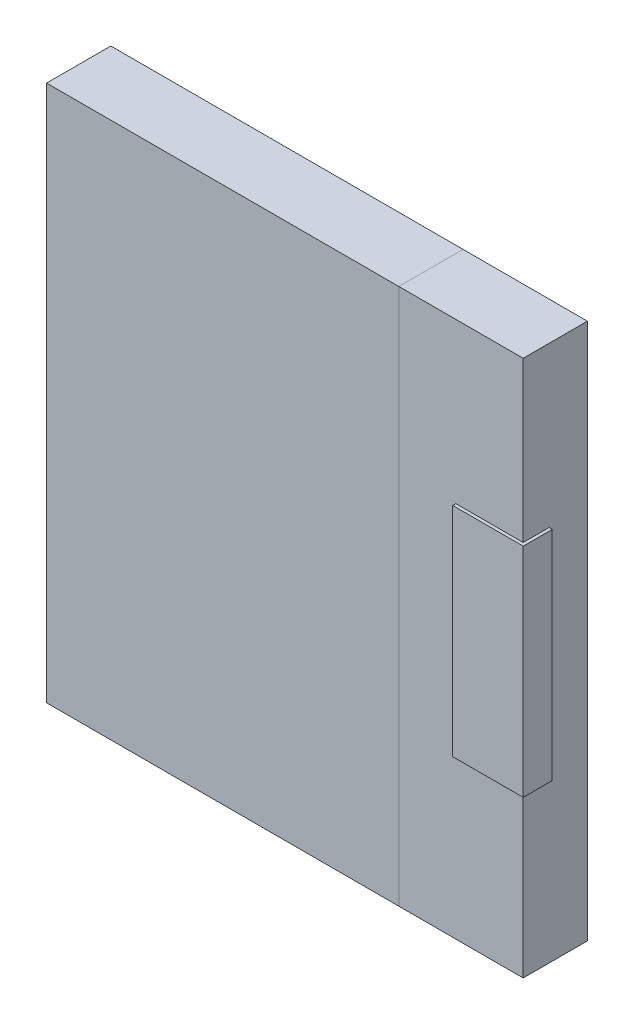
ISO-10303-21;
HEADER;
FILE_DESCRIPTION(('STEP AP214'),'2;1');
FILE_NAME('part.step','',(''),(''),'','','');
FILE_SCHEMA(('AUTOMOTIVE_DESIGN { 1 0 10303 214 1 1 1 1 }'));
ENDSEC;
DATA;
#1=APPLICATION_CONTEXT('core data for automotive mechanical design processes');
#2=APPLICATION_PROTOCOL_DEFINITION('international standard','automotive_design',2000,#1);
#3=PRODUCT_CONTEXT('',#1,'mechanical');
#4=PRODUCT('Part','Part','',(#3));
#5=PRODUCT_RELATED_PRODUCT_CATEGORY('part','',(#4));
#6=PRODUCT_DEFINITION_FORMATION('','',#4);
#7=PRODUCT_DEFINITION_CONTEXT('part definition',#1,'design');
#8=PRODUCT_DEFINITION('design','',#6,#7);
#9=PRODUCT_DEFINITION_SHAPE('','',#8);
#10=(LENGTH_UNIT() NAMED_UNIT(*) SI_UNIT(.MILLI.,.METRE.));
#11=(NAMED_UNIT(*) PLANE_ANGLE_UNIT() SI_UNIT($,.RADIAN.));
#12=(NAMED_UNIT(*) SI_UNIT($,.STERADIAN.) SOLID_ANGLE_UNIT());
#13=UNCERTAINTY_MEASURE_WITH_UNIT(LENGTH_MEASURE(1.E-05),#10,'distance_accuracy_value','');
#14=(GEOMETRIC_REPRESENTATION_CONTEXT(3) GLOBAL_UNCERTAINTY_ASSIGNED_CONTEXT((#13)) GLOBAL_UNIT_ASSIGNED_CONTEXT((#10,
#11,#12)) REPRESENTATION_CONTEXT('',''));
#15=CARTESIAN_POINT('',(0.,0.,0.));
#16=DIRECTION('',(0.,0.,1.));
#17=DIRECTION('',(1.,0.,0.));
#18=AXIS2_PLACEMENT_3D('',#15,#16,#17);
#19=CARTESIAN_POINT('',(0.,0.,31.));
#20=DIRECTION('',(0.,0.,1.));
#21=DIRECTION('',(1.,0.,0.));
#22=AXIS2_PLACEMENT_3D('',#19,#20,#21);
#23=PLANE('',#22);
#24=DIRECTION('',(0.,1.,0.));
#25=VECTOR('',#24,1.);
#26=CARTESIAN_POINT('',(230.,105.,31.));
#27=LINE('',#26,#25);
#28=CARTESIAN_POINT('',(230.,-105.,31.));
#29=VERTEX_POINT('',#28);
#30=CARTESIAN_POINT('',(230.,105.,31.));
#31=VERTEX_POINT('',#30);
#32=EDGE_CURVE('E64',#29,#31,#27,.T.);
#33=ORIENTED_EDGE('',*,*,#32,.F.);
#34=DIRECTION('',(1.,0.,0.));
#35=VECTOR('',#34,1.);
#36=CARTESIAN_POINT('',(165.,-105.,31.));
#37=LINE('',#36,#35);
#38=CARTESIAN_POINT('',(165.,-105.,31.));
#39=VERTEX_POINT('',#38);
#40=EDGE_CURVE('E142',#39,#29,#37,.T.);
#41=ORIENTED_EDGE('',*,*,#40,.F.);
#42=DIRECTION('',(0.,-1.,0.));
#43=VECTOR('',#42,1.);
#44=CARTESIAN_POINT('',(165.,105.,31.));
#45=LINE('',#44,#43);
#46=CARTESIAN_POINT('',(165.,105.,31.));
#47=VERTEX_POINT('',#46);
#48=EDGE_CURVE('E89',#47,#39,#45,.T.);
#49=ORIENTED_EDGE('',*,*,#48,.F.);
#50=DIRECTION('',(-1.,0.,0.));
#51=VECTOR('',#50,1.);
#52=CARTESIAN_POINT('',(165.,105.,31.));
#53=LINE('',#52,#51);
#54=EDGE_CURVE('E139',#31,#47,#53,.T.);
#55=ORIENTED_EDGE('',*,*,#54,.F.);
#56=EDGE_LOOP('',(#33,#41,#49,#55));
#57=FACE_BOUND('',#56,.T.);
#58=ADVANCED_FACE('F49',(#57),#23,.F.);
#59=CARTESIAN_POINT('',(233.,105.,34.));
#60=DIRECTION('',(-1.,0.,0.));
#61=DIRECTION('',(0.,-1.,0.));
#62=AXIS2_PLACEMENT_3D('',#59,#60,#61);
#63=PLANE('',#62);
#64=DIRECTION('',(0.,0.,-1.));
#65=VECTOR('',#64,1.);
#66=CARTESIAN_POINT('',(233.,-105.,34.));
#67=LINE('',#66,#65);
#68=CARTESIAN_POINT('',(233.,-105.,34.));
#69=VERTEX_POINT('',#68);
#70=CARTESIAN_POINT('',(233.,-105.,6.));
#71=VERTEX_POINT('',#70);
#72=EDGE_CURVE('E120',#69,#71,#67,.T.);
#73=ORIENTED_EDGE('',*,*,#72,.T.);
#74=DIRECTION('',(0.,-1.,0.));
#75=VECTOR('',#74,1.);
#76=CARTESIAN_POINT('',(233.,105.,6.));
#77=LINE('',#76,#75);
#78=CARTESIAN_POINT('',(233.,105.,6.));
#79=VERTEX_POINT('',#78);
#80=EDGE_CURVE('E119',#79,#71,#77,.T.);
#81=ORIENTED_EDGE('',*,*,#80,.F.);
#82=DIRECTION('',(0.,0.,-1.));
#83=VECTOR('',#82,1.);
#84=CARTESIAN_POINT('',(233.,105.,34.));
#85=LINE('',#84,#83);
#86=CARTESIAN_POINT('',(233.,105.,34.));
#87=VERTEX_POINT('',#86);
#88=EDGE_CURVE('E12',#87,#79,#85,.T.);
#89=ORIENTED_EDGE('',*,*,#88,.F.);
#90=DIRECTION('',(0.,1.,0.));
#91=VECTOR('',#90,1.);
#92=CARTESIAN_POINT('',(233.,105.,34.));
#93=LINE('',#92,#91);
#94=EDGE_CURVE('E140',#69,#87,#93,.T.);
#95=ORIENTED_EDGE('',*,*,#94,.F.);
#96=EDGE_LOOP('',(#73,#81,#89,#95));
#97=FACE_BOUND('',#96,.T.);
#98=ADVANCED_FACE('F51',(#97),#63,.F.);
#99=CARTESIAN_POINT('',(165.,105.,34.));
#100=DIRECTION('',(0.,-1.,0.));
#101=DIRECTION('',(0.,0.,-1.));
#102=AXIS2_PLACEMENT_3D('',#99,#100,#101);
#103=PLANE('',#102);
#104=ORIENTED_EDGE('',*,*,#88,.T.);
#105=DIRECTION('',(1.,0.,0.));
#106=VECTOR('',#105,1.);
#107=CARTESIAN_POINT('',(230.,105.,6.));
#108=LINE('',#107,#106);
#109=CARTESIAN_POINT('',(230.,105.,6.));
#110=VERTEX_POINT('',#109);
#111=EDGE_CURVE('E115',#110,#79,#108,.T.);
#112=ORIENTED_EDGE('',*,*,#111,.F.);
#113=DIRECTION('',(0.,0.,1.));
#114=VECTOR('',#113,1.);
#115=CARTESIAN_POINT('',(230.,105.,6.));
#116=LINE('',#115,#114);
#117=EDGE_CURVE('E133',#110,#31,#116,.T.);
#118=ORIENTED_EDGE('',*,*,#117,.T.);
#119=ORIENTED_EDGE('',*,*,#54,.T.);
#120=DIRECTION('',(0.,0.,-1.));
#121=VECTOR('',#120,1.);
#122=CARTESIAN_POINT('',(165.,105.,34.));
#123=LINE('',#122,#121);
#124=CARTESIAN_POINT('',(165.,105.,34.));
#125=VERTEX_POINT('',#124);
#126=EDGE_CURVE('E57',#125,#47,#123,.T.);
#127=ORIENTED_EDGE('',*,*,#126,.F.);
#128=DIRECTION('',(-1.,0.,0.));
#129=VECTOR('',#128,1.);
#130=CARTESIAN_POINT('',(165.,105.,34.));
#131=LINE('',#130,#129);
#132=EDGE_CURVE('E96',#87,#125,#131,.T.);
#133=ORIENTED_EDGE('',*,*,#132,.F.);
#134=EDGE_LOOP('',(#104,#112,#118,#119,#127,#133));
#135=FACE_BOUND('',#134,.T.);
#136=ADVANCED_FACE('F112',(#135),#103,.F.);
#137=CARTESIAN_POINT('',(165.,105.,34.));
#138=DIRECTION('',(1.,0.,0.));
#139=DIRECTION('',(0.,0.,-1.));
#140=AXIS2_PLACEMENT_3D('',#137,#138,#139);
#141=PLANE('',#140);
#142=ORIENTED_EDGE('',*,*,#48,.T.);
#143=DIRECTION('',(0.,0.,-1.));
#144=VECTOR('',#143,1.);
#145=CARTESIAN_POINT('',(165.,-105.,34.));
#146=LINE('',#145,#144);
#147=CARTESIAN_POINT('',(165.,-105.,34.));
#148=VERTEX_POINT('',#147);
#149=EDGE_CURVE('E151',#148,#39,#146,.T.);
#150=ORIENTED_EDGE('',*,*,#149,.F.);
#151=DIRECTION('',(0.,-1.,0.));
#152=VECTOR('',#151,1.);
#153=CARTESIAN_POINT('',(165.,105.,34.));
#154=LINE('',#153,#152);
#155=EDGE_CURVE('E144',#125,#148,#154,.T.);
#156=ORIENTED_EDGE('',*,*,#155,.F.);
#157=ORIENTED_EDGE('',*,*,#126,.T.);
#158=EDGE_LOOP('',(#142,#150,#156,#157));
#159=FACE_BOUND('',#158,.T.);
#160=ADVANCED_FACE('F153',(#159),#141,.F.);
#161=CARTESIAN_POINT('',(165.,-105.,34.));
#162=DIRECTION('',(0.,1.,0.));
#163=DIRECTION('',(0.,0.,1.));
#164=AXIS2_PLACEMENT_3D('',#161,#162,#163);
#165=PLANE('',#164);
#166=ORIENTED_EDGE('',*,*,#40,.T.);
#167=DIRECTION('',(0.,0.,1.));
#168=VECTOR('',#167,1.);
#169=CARTESIAN_POINT('',(230.,-105.,6.));
#170=LINE('',#169,#168);
#171=CARTESIAN_POINT('',(230.,-105.,6.));
#172=VERTEX_POINT('',#171);
#173=EDGE_CURVE('E136',#172,#29,#170,.T.);
#174=ORIENTED_EDGE('',*,*,#173,.F.);
#175=DIRECTION('',(-1.,0.,0.));
#176=VECTOR('',#175,1.);
#177=CARTESIAN_POINT('',(233.,-105.,6.));
#178=LINE('',#177,#176);
#179=EDGE_CURVE('E123',#71,#172,#178,.T.);
#180=ORIENTED_EDGE('',*,*,#179,.F.);
#181=ORIENTED_EDGE('',*,*,#72,.F.);
#182=DIRECTION('',(1.,0.,0.));
#183=VECTOR('',#182,1.);
#184=CARTESIAN_POINT('',(165.,-105.,34.));
#185=LINE('',#184,#183);
#186=EDGE_CURVE('E73',#148,#69,#185,.T.);
#187=ORIENTED_EDGE('',*,*,#186,.F.);
#188=ORIENTED_EDGE('',*,*,#149,.T.);
#189=EDGE_LOOP('',(#166,#174,#180,#181,#187,#188));
#190=FACE_BOUND('',#189,.T.);
#191=ADVANCED_FACE('F156',(#190),#165,.F.);
#192=CARTESIAN_POINT('',(0.,0.,34.));
#193=DIRECTION('',(0.,0.,1.));
#194=DIRECTION('',(1.,0.,0.));
#195=AXIS2_PLACEMENT_3D('',#192,#193,#194);
#196=PLANE('',#195);
#197=ORIENTED_EDGE('',*,*,#94,.T.);
#198=ORIENTED_EDGE('',*,*,#132,.T.);
#199=ORIENTED_EDGE('',*,*,#155,.T.);
#200=ORIENTED_EDGE('',*,*,#186,.T.);
#201=EDGE_LOOP('',(#197,#198,#199,#200));
#202=FACE_BOUND('',#201,.T.);
#203=ADVANCED_FACE('F160',(#202),#196,.T.);
#204=CARTESIAN_POINT('',(230.,105.,6.));
#205=DIRECTION('',(1.,0.,0.));
#206=DIRECTION('',(0.,1.,0.));
#207=AXIS2_PLACEMENT_3D('',#204,#205,#206);
#208=PLANE('',#207);
#209=ORIENTED_EDGE('',*,*,#32,.T.);
#210=ORIENTED_EDGE('',*,*,#117,.F.);
#211=DIRECTION('',(0.,1.,0.));
#212=VECTOR('',#211,1.);
#213=CARTESIAN_POINT('',(230.,105.,6.));
#214=LINE('',#213,#212);
#215=EDGE_CURVE('E127',#172,#110,#214,.T.);
#216=ORIENTED_EDGE('',*,*,#215,.F.);
#217=ORIENTED_EDGE('',*,*,#173,.T.);
#218=EDGE_LOOP('',(#209,#210,#216,#217));
#219=FACE_BOUND('',#218,.T.);
#220=ADVANCED_FACE('F158',(#219),#208,.F.);
#221=CARTESIAN_POINT('',(0.,0.,6.));
#222=DIRECTION('',(0.,0.,-1.));
#223=DIRECTION('',(-1.,0.,0.));
#224=AXIS2_PLACEMENT_3D('',#221,#222,#223);
#225=PLANE('',#224);
#226=ORIENTED_EDGE('',*,*,#111,.T.);
#227=ORIENTED_EDGE('',*,*,#80,.T.);
#228=ORIENTED_EDGE('',*,*,#179,.T.);
#229=ORIENTED_EDGE('',*,*,#215,.T.);
#230=EDGE_LOOP('',(#226,#227,#228,#229));
#231=FACE_BOUND('',#230,.T.);
#232=ADVANCED_FACE('F125',(#231),#225,.T.);
#233=CLOSED_SHELL('',(#58,#98,#136,#160,#191,#203,#220,#232));
#234=MANIFOLD_SOLID_BREP('B2',#233);
#235=CARTESIAN_POINT('',(110.,-259.,-31.01));
#236=DIRECTION('',(1.,0.,0.));
#237=DIRECTION('',(0.,0.,-1.));
#238=AXIS2_PLACEMENT_3D('',#235,#236,#237);
#239=PLANE('',#238);
#240=DIRECTION('',(0.,0.,-1.));
#241=VECTOR('',#240,1.);
#242=CARTESIAN_POINT('',(110.,-259.,31.));
#243=LINE('',#242,#241);
#244=CARTESIAN_POINT('',(110.,-259.,31.));
#245=VERTEX_POINT('',#244);
#246=CARTESIAN_POINT('',(110.,-259.,-31.));
#247=VERTEX_POINT('',#246);
#248=EDGE_CURVE('E293',#245,#247,#243,.T.);
#249=ORIENTED_EDGE('',*,*,#248,.T.);
#250=DIRECTION('',(0.,1.,0.));
#251=VECTOR('',#250,1.);
#252=CARTESIAN_POINT('',(110.,0.,-31.));
#253=LINE('',#252,#251);
#254=CARTESIAN_POINT('',(110.,259.,-31.));
#255=VERTEX_POINT('',#254);
#256=EDGE_CURVE('E319',#247,#255,#253,.T.);
#257=ORIENTED_EDGE('',*,*,#256,.T.);
#258=DIRECTION('',(0.,0.,-1.));
#259=VECTOR('',#258,1.);
#260=CARTESIAN_POINT('',(110.,259.,31.));
#261=LINE('',#260,#259);
#262=CARTESIAN_POINT('',(110.,259.,31.));
#263=VERTEX_POINT('',#262);
#264=EDGE_CURVE('E310',#263,#255,#261,.T.);
#265=ORIENTED_EDGE('',*,*,#264,.F.);
#266=DIRECTION('',(0.,1.,0.));
#267=VECTOR('',#266,1.);
#268=CARTESIAN_POINT('',(110.,0.,31.));
#269=LINE('',#268,#267);
#270=EDGE_CURVE('E307',#245,#263,#269,.T.);
#271=ORIENTED_EDGE('',*,*,#270,.F.);
#272=EDGE_LOOP('',(#249,#257,#265,#271));
#273=FACE_BOUND('',#272,.T.);
#274=ADVANCED_FACE('F248',(#273),#239,.T.);
#275=CARTESIAN_POINT('',(-230.,-259.,31.));
#276=DIRECTION('',(0.,1.,0.));
#277=DIRECTION('',(0.,0.,1.));
#278=AXIS2_PLACEMENT_3D('',#275,#276,#277);
#279=PLANE('',#278);
#280=ORIENTED_EDGE('',*,*,#248,.F.);
#281=DIRECTION('',(1.,0.,0.));
#282=VECTOR('',#281,1.);
#283=CARTESIAN_POINT('',(-230.,-259.,31.));
#284=LINE('',#283,#282);
#285=CARTESIAN_POINT('',(-230.,-259.,31.));
#286=VERTEX_POINT('',#285);
#287=EDGE_CURVE('E287',#286,#245,#284,.T.);
#288=ORIENTED_EDGE('',*,*,#287,.F.);
#289=DIRECTION('',(0.,0.,-1.));
#290=VECTOR('',#289,1.);
#291=CARTESIAN_POINT('',(-230.,-259.,31.));
#292=LINE('',#291,#290);
#293=CARTESIAN_POINT('',(-230.,-259.,-31.));
#294=VERTEX_POINT('',#293);
#295=EDGE_CURVE('E291',#286,#294,#292,.T.);
#296=ORIENTED_EDGE('',*,*,#295,.T.);
#297=DIRECTION('',(1.,0.,0.));
#298=VECTOR('',#297,1.);
#299=CARTESIAN_POINT('',(-230.,-259.,-31.));
#300=LINE('',#299,#298);
#301=EDGE_CURVE('E257',#294,#247,#300,.T.);
#302=ORIENTED_EDGE('',*,*,#301,.T.);
#303=EDGE_LOOP('',(#280,#288,#296,#302));
#304=FACE_BOUND('',#303,.T.);
#305=ADVANCED_FACE('F289',(#304),#279,.F.);
#306=CARTESIAN_POINT('',(-230.,259.,31.));
#307=DIRECTION('',(0.,1.,0.));
#308=DIRECTION('',(0.,0.,1.));
#309=AXIS2_PLACEMENT_3D('',#306,#307,#308);
#310=PLANE('',#309);
#311=DIRECTION('',(1.,0.,0.));
#312=VECTOR('',#311,1.);
#313=CARTESIAN_POINT('',(-230.,259.,31.));
#314=LINE('',#313,#312);
#315=CARTESIAN_POINT('',(-230.,259.,31.));
#316=VERTEX_POINT('',#315);
#317=EDGE_CURVE('E297',#316,#263,#314,.T.);
#318=ORIENTED_EDGE('',*,*,#317,.T.);
#319=ORIENTED_EDGE('',*,*,#264,.T.);
#320=DIRECTION('',(1.,0.,0.));
#321=VECTOR('',#320,1.);
#322=CARTESIAN_POINT('',(-230.,259.,-31.));
#323=LINE('',#322,#321);
#324=CARTESIAN_POINT('',(-230.,259.,-31.));
#325=VERTEX_POINT('',#324);
#326=EDGE_CURVE('E303',#325,#255,#323,.T.);
#327=ORIENTED_EDGE('',*,*,#326,.F.);
#328=DIRECTION('',(0.,0.,-1.));
#329=VECTOR('',#328,1.);
#330=CARTESIAN_POINT('',(-230.,259.,31.));
#331=LINE('',#330,#329);
#332=EDGE_CURVE('E306',#316,#325,#331,.T.);
#333=ORIENTED_EDGE('',*,*,#332,.F.);
#334=EDGE_LOOP('',(#318,#319,#327,#333));
#335=FACE_BOUND('',#334,.T.);
#336=ADVANCED_FACE('F388',(#335),#310,.T.);
#337=CARTESIAN_POINT('',(0.,0.,31.));
#338=DIRECTION('',(0.,0.,1.));
#339=DIRECTION('',(1.,0.,0.));
#340=AXIS2_PLACEMENT_3D('',#337,#338,#339);
#341=PLANE('',#340);
#342=ORIENTED_EDGE('',*,*,#287,.T.);
#343=ORIENTED_EDGE('',*,*,#270,.T.);
#344=ORIENTED_EDGE('',*,*,#317,.F.);
#345=DIRECTION('',(0.,-1.,0.));
#346=VECTOR('',#345,1.);
#347=CARTESIAN_POINT('',(-230.,259.,31.));
#348=LINE('',#347,#346);
#349=EDGE_CURVE('E296',#316,#286,#348,.T.);
#350=ORIENTED_EDGE('',*,*,#349,.T.);
#351=EDGE_LOOP('',(#342,#343,#344,#350));
#352=FACE_BOUND('',#351,.T.);
#353=ADVANCED_FACE('F250',(#352),#341,.T.);
#354=CARTESIAN_POINT('',(0.,0.,-31.));
#355=DIRECTION('',(0.,0.,1.));
#356=DIRECTION('',(1.,0.,0.));
#357=AXIS2_PLACEMENT_3D('',#354,#355,#356);
#358=PLANE('',#357);
#359=DIRECTION('',(1.,0.,0.));
#360=VECTOR('',#359,1.);
#361=CARTESIAN_POINT('',(-230.,-258.,-31.));
#362=LINE('',#361,#360);
#363=CARTESIAN_POINT('',(-229.,-258.,-31.));
#364=VERTEX_POINT('',#363);
#365=CARTESIAN_POINT('',(109.,-258.,-31.));
#366=VERTEX_POINT('',#365);
#367=EDGE_CURVE('E361',#364,#366,#362,.T.);
#368=ORIENTED_EDGE('',*,*,#367,.T.);
#369=DIRECTION('',(0.,1.,0.));
#370=VECTOR('',#369,1.);
#371=CARTESIAN_POINT('',(109.,0.,-31.));
#372=LINE('',#371,#370);
#373=CARTESIAN_POINT('',(109.,258.,-31.));
#374=VERTEX_POINT('',#373);
#375=EDGE_CURVE('E343',#366,#374,#372,.T.);
#376=ORIENTED_EDGE('',*,*,#375,.T.);
#377=DIRECTION('',(1.,0.,0.));
#378=VECTOR('',#377,1.);
#379=CARTESIAN_POINT('',(-230.,258.,-31.));
#380=LINE('',#379,#378);
#381=CARTESIAN_POINT('',(-229.,258.,-31.));
#382=VERTEX_POINT('',#381);
#383=EDGE_CURVE('E313',#382,#374,#380,.T.);
#384=ORIENTED_EDGE('',*,*,#383,.F.);
#385=DIRECTION('',(0.,-1.,0.));
#386=VECTOR('',#385,1.);
#387=CARTESIAN_POINT('',(-229.,259.,-31.));
#388=LINE('',#387,#386);
#389=EDGE_CURVE('E265',#382,#364,#388,.T.);
#390=ORIENTED_EDGE('',*,*,#389,.T.);
#391=EDGE_LOOP('',(#368,#376,#384,#390));
#392=FACE_BOUND('',#391,.T.);
#393=ORIENTED_EDGE('',*,*,#256,.F.);
#394=ORIENTED_EDGE('',*,*,#301,.F.);
#395=DIRECTION('',(0.,-1.,0.));
#396=VECTOR('',#395,1.);
#397=CARTESIAN_POINT('',(-230.,259.,-31.));
#398=LINE('',#397,#396);
#399=EDGE_CURVE('E47',#325,#294,#398,.T.);
#400=ORIENTED_EDGE('',*,*,#399,.F.);
#401=ORIENTED_EDGE('',*,*,#326,.T.);
#402=EDGE_LOOP('',(#393,#394,#400,#401));
#403=FACE_BOUND('',#402,.T.);
#404=ADVANCED_FACE('F363',(#392,#403),#358,.F.);
#405=CARTESIAN_POINT('',(-230.,259.,31.));
#406=DIRECTION('',(1.,0.,0.));
#407=DIRECTION('',(0.,1.,0.));
#408=AXIS2_PLACEMENT_3D('',#405,#406,#407);
#409=PLANE('',#408);
#410=CARTESIAN_POINT('',(-230.,201.25,-16.));
#411=DIRECTION('',(-1.,0.,0.));
#412=DIRECTION('',(0.,-1.,0.));
#413=AXIS2_PLACEMENT_3D('',#410,#411,#412);
#414=CIRCLE('',#413,3.25);
#415=CARTESIAN_POINT('',(-230.,198.,-16.));
#416=VERTEX_POINT('',#415);
#417=EDGE_CURVE('E330',#416,#416,#414,.T.);
#418=ORIENTED_EDGE('',*,*,#417,.F.);
#419=EDGE_LOOP('',(#418));
#420=FACE_BOUND('',#419,.T.);
#421=CARTESIAN_POINT('',(-230.,181.25,-16.));
#422=DIRECTION('',(-1.,0.,0.));
#423=DIRECTION('',(0.,-1.,0.));
#424=AXIS2_PLACEMENT_3D('',#421,#422,#423);
#425=CIRCLE('',#424,3.25);
#426=CARTESIAN_POINT('',(-230.,178.,-16.));
#427=VERTEX_POINT('',#426);
#428=EDGE_CURVE('E450',#427,#427,#425,.T.);
#429=ORIENTED_EDGE('',*,*,#428,.F.);
#430=EDGE_LOOP('',(#429));
#431=FACE_BOUND('',#430,.T.);
#432=CARTESIAN_POINT('',(-230.,161.25,-16.));
#433=DIRECTION('',(-1.,0.,0.));
#434=DIRECTION('',(0.,-1.,0.));
#435=AXIS2_PLACEMENT_3D('',#432,#433,#434);
#436=CIRCLE('',#435,3.25);
#437=CARTESIAN_POINT('',(-230.,158.,-16.));
#438=VERTEX_POINT('',#437);
#439=EDGE_CURVE('E453',#438,#438,#436,.T.);
#440=ORIENTED_EDGE('',*,*,#439,.F.);
#441=EDGE_LOOP('',(#440));
#442=FACE_BOUND('',#441,.T.);
#443=CARTESIAN_POINT('',(-230.,-162.25,-16.));
#444=DIRECTION('',(-1.,0.,0.));
#445=DIRECTION('',(0.,-1.,0.));
#446=AXIS2_PLACEMENT_3D('',#443,#444,#445);
#447=CIRCLE('',#446,3.25);
#448=CARTESIAN_POINT('',(-230.,-165.5,-16.));
#449=VERTEX_POINT('',#448);
#450=EDGE_CURVE('E458',#449,#449,#447,.T.);
#451=ORIENTED_EDGE('',*,*,#450,.F.);
#452=EDGE_LOOP('',(#451));
#453=FACE_BOUND('',#452,.T.);
#454=CARTESIAN_POINT('',(-230.,-182.25,-16.));
#455=DIRECTION('',(-1.,0.,0.));
#456=DIRECTION('',(0.,-1.,0.));
#457=AXIS2_PLACEMENT_3D('',#454,#455,#456);
#458=CIRCLE('',#457,3.25);
#459=CARTESIAN_POINT('',(-230.,-185.5,-16.));
#460=VERTEX_POINT('',#459);
#461=EDGE_CURVE('E461',#460,#460,#458,.T.);
#462=ORIENTED_EDGE('',*,*,#461,.F.);
#463=EDGE_LOOP('',(#462));
#464=FACE_BOUND('',#463,.T.);
#465=CARTESIAN_POINT('',(-230.,-202.25,-16.));
#466=DIRECTION('',(-1.,0.,0.));
#467=DIRECTION('',(0.,-1.,0.));
#468=AXIS2_PLACEMENT_3D('',#465,#466,#467);
#469=CIRCLE('',#468,3.25);
#470=CARTESIAN_POINT('',(-230.,-205.5,-16.));
#471=VERTEX_POINT('',#470);
#472=EDGE_CURVE('E464',#471,#471,#469,.T.);
#473=ORIENTED_EDGE('',*,*,#472,.F.);
#474=EDGE_LOOP('',(#473));
#475=FACE_BOUND('',#474,.T.);
#476=ORIENTED_EDGE('',*,*,#399,.T.);
#477=ORIENTED_EDGE('',*,*,#295,.F.);
#478=ORIENTED_EDGE('',*,*,#349,.F.);
#479=ORIENTED_EDGE('',*,*,#332,.T.);
#480=EDGE_LOOP('',(#476,#477,#478,#479));
#481=FACE_BOUND('',#480,.T.);
#482=ADVANCED_FACE('F305',(#420,#431,#442,#453,#464,#475,#481),#409,.F.);
#483=CARTESIAN_POINT('',(109.,-259.,-31.01));
#484=DIRECTION('',(1.,0.,0.));
#485=DIRECTION('',(0.,0.,-1.));
#486=AXIS2_PLACEMENT_3D('',#483,#484,#485);
#487=PLANE('',#486);
#488=DIRECTION('',(0.,0.,-1.));
#489=VECTOR('',#488,1.);
#490=CARTESIAN_POINT('',(109.,-258.,31.));
#491=LINE('',#490,#489);
#492=CARTESIAN_POINT('',(109.,-258.,30.));
#493=VERTEX_POINT('',#492);
#494=EDGE_CURVE('E347',#493,#366,#491,.T.);
#495=ORIENTED_EDGE('',*,*,#494,.F.);
#496=DIRECTION('',(0.,1.,0.));
#497=VECTOR('',#496,1.);
#498=CARTESIAN_POINT('',(109.,0.,30.));
#499=LINE('',#498,#497);
#500=CARTESIAN_POINT('',(109.,258.,30.));
#501=VERTEX_POINT('',#500);
#502=EDGE_CURVE('E469',#493,#501,#499,.T.);
#503=ORIENTED_EDGE('',*,*,#502,.T.);
#504=DIRECTION('',(0.,0.,-1.));
#505=VECTOR('',#504,1.);
#506=CARTESIAN_POINT('',(109.,258.,31.));
#507=LINE('',#506,#505);
#508=EDGE_CURVE('E355',#501,#374,#507,.T.);
#509=ORIENTED_EDGE('',*,*,#508,.T.);
#510=ORIENTED_EDGE('',*,*,#375,.F.);
#511=EDGE_LOOP('',(#495,#503,#509,#510));
#512=FACE_BOUND('',#511,.T.);
#513=ADVANCED_FACE('F394',(#512),#487,.F.);
#514=CARTESIAN_POINT('',(-230.,-258.,31.));
#515=DIRECTION('',(0.,1.,0.));
#516=DIRECTION('',(0.,0.,1.));
#517=AXIS2_PLACEMENT_3D('',#514,#515,#516);
#518=PLANE('',#517);
#519=ORIENTED_EDGE('',*,*,#494,.T.);
#520=ORIENTED_EDGE('',*,*,#367,.F.);
#521=DIRECTION('',(0.,0.,-1.));
#522=VECTOR('',#521,1.);
#523=CARTESIAN_POINT('',(-229.,-258.,31.));
#524=LINE('',#523,#522);
#525=CARTESIAN_POINT('',(-229.,-258.,30.));
#526=VERTEX_POINT('',#525);
#527=EDGE_CURVE('E472',#526,#364,#524,.T.);
#528=ORIENTED_EDGE('',*,*,#527,.F.);
#529=DIRECTION('',(1.,0.,0.));
#530=VECTOR('',#529,1.);
#531=CARTESIAN_POINT('',(-230.,-258.,30.));
#532=LINE('',#531,#530);
#533=EDGE_CURVE('E473',#526,#493,#532,.T.);
#534=ORIENTED_EDGE('',*,*,#533,.T.);
#535=EDGE_LOOP('',(#519,#520,#528,#534));
#536=FACE_BOUND('',#535,.T.);
#537=ADVANCED_FACE('F405',(#536),#518,.T.);
#538=CARTESIAN_POINT('',(-230.,258.,31.));
#539=DIRECTION('',(0.,1.,0.));
#540=DIRECTION('',(0.,0.,1.));
#541=AXIS2_PLACEMENT_3D('',#538,#539,#540);
#542=PLANE('',#541);
#543=DIRECTION('',(1.,0.,0.));
#544=VECTOR('',#543,1.);
#545=CARTESIAN_POINT('',(-230.,258.,30.));
#546=LINE('',#545,#544);
#547=CARTESIAN_POINT('',(-229.,258.,30.));
#548=VERTEX_POINT('',#547);
#549=EDGE_CURVE('E477',#548,#501,#546,.T.);
#550=ORIENTED_EDGE('',*,*,#549,.F.);
#551=DIRECTION('',(0.,0.,-1.));
#552=VECTOR('',#551,1.);
#553=CARTESIAN_POINT('',(-229.,258.,31.));
#554=LINE('',#553,#552);
#555=EDGE_CURVE('E359',#548,#382,#554,.T.);
#556=ORIENTED_EDGE('',*,*,#555,.T.);
#557=ORIENTED_EDGE('',*,*,#383,.T.);
#558=ORIENTED_EDGE('',*,*,#508,.F.);
#559=EDGE_LOOP('',(#550,#556,#557,#558));
#560=FACE_BOUND('',#559,.T.);
#561=ADVANCED_FACE('F415',(#560),#542,.F.);
#562=CARTESIAN_POINT('',(0.,0.,30.));
#563=DIRECTION('',(0.,0.,1.));
#564=DIRECTION('',(1.,0.,0.));
#565=AXIS2_PLACEMENT_3D('',#562,#563,#564);
#566=PLANE('',#565);
#567=ORIENTED_EDGE('',*,*,#533,.F.);
#568=DIRECTION('',(0.,-1.,0.));
#569=VECTOR('',#568,1.);
#570=CARTESIAN_POINT('',(-229.,259.,30.));
#571=LINE('',#570,#569);
#572=EDGE_CURVE('E476',#548,#526,#571,.T.);
#573=ORIENTED_EDGE('',*,*,#572,.F.);
#574=ORIENTED_EDGE('',*,*,#549,.T.);
#575=ORIENTED_EDGE('',*,*,#502,.F.);
#576=EDGE_LOOP('',(#567,#573,#574,#575));
#577=FACE_BOUND('',#576,.T.);
#578=ADVANCED_FACE('F411',(#577),#566,.F.);
#579=CARTESIAN_POINT('',(-229.,259.,31.));
#580=DIRECTION('',(1.,0.,0.));
#581=DIRECTION('',(0.,1.,0.));
#582=AXIS2_PLACEMENT_3D('',#579,#580,#581);
#583=PLANE('',#582);
#584=CARTESIAN_POINT('',(-229.,201.25,-16.));
#585=DIRECTION('',(1.,0.,0.));
#586=DIRECTION('',(0.,1.,0.));
#587=AXIS2_PLACEMENT_3D('',#584,#585,#586);
#588=CIRCLE('',#587,3.25);
#589=CARTESIAN_POINT('',(-229.,204.5,-16.));
#590=VERTEX_POINT('',#589);
#591=EDGE_CURVE('E252',#590,#590,#588,.T.);
#592=ORIENTED_EDGE('',*,*,#591,.F.);
#593=EDGE_LOOP('',(#592));
#594=FACE_BOUND('',#593,.T.);
#595=CARTESIAN_POINT('',(-229.,181.25,-16.));
#596=DIRECTION('',(1.,0.,0.));
#597=DIRECTION('',(0.,1.,0.));
#598=AXIS2_PLACEMENT_3D('',#595,#596,#597);
#599=CIRCLE('',#598,3.25);
#600=CARTESIAN_POINT('',(-229.,184.5,-16.));
#601=VERTEX_POINT('',#600);
#602=EDGE_CURVE('E338',#601,#601,#599,.T.);
#603=ORIENTED_EDGE('',*,*,#602,.F.);
#604=EDGE_LOOP('',(#603));
#605=FACE_BOUND('',#604,.T.);
#606=CARTESIAN_POINT('',(-229.,161.25,-16.));
#607=DIRECTION('',(1.,0.,0.));
#608=DIRECTION('',(0.,1.,0.));
#609=AXIS2_PLACEMENT_3D('',#606,#607,#608);
#610=CIRCLE('',#609,3.25);
#611=CARTESIAN_POINT('',(-229.,164.5,-16.));
#612=VERTEX_POINT('',#611);
#613=EDGE_CURVE('E336',#612,#612,#610,.T.);
#614=ORIENTED_EDGE('',*,*,#613,.F.);
#615=EDGE_LOOP('',(#614));
#616=FACE_BOUND('',#615,.T.);
#617=CARTESIAN_POINT('',(-229.,-162.25,-16.));
#618=DIRECTION('',(1.,0.,0.));
#619=DIRECTION('',(0.,1.,0.));
#620=AXIS2_PLACEMENT_3D('',#617,#618,#619);
#621=CIRCLE('',#620,3.25);
#622=CARTESIAN_POINT('',(-229.,-159.,-16.));
#623=VERTEX_POINT('',#622);
#624=EDGE_CURVE('E333',#623,#623,#621,.T.);
#625=ORIENTED_EDGE('',*,*,#624,.F.);
#626=EDGE_LOOP('',(#625));
#627=FACE_BOUND('',#626,.T.);
#628=CARTESIAN_POINT('',(-229.,-182.25,-16.));
#629=DIRECTION('',(1.,0.,0.));
#630=DIRECTION('',(0.,1.,0.));
#631=AXIS2_PLACEMENT_3D('',#628,#629,#630);
#632=CIRCLE('',#631,3.25);
#633=CARTESIAN_POINT('',(-229.,-179.,-16.));
#634=VERTEX_POINT('',#633);
#635=EDGE_CURVE('E329',#634,#634,#632,.T.);
#636=ORIENTED_EDGE('',*,*,#635,.F.);
#637=EDGE_LOOP('',(#636));
#638=FACE_BOUND('',#637,.T.);
#639=CARTESIAN_POINT('',(-229.,-202.25,-16.));
#640=DIRECTION('',(1.,0.,0.));
#641=DIRECTION('',(0.,1.,0.));
#642=AXIS2_PLACEMENT_3D('',#639,#640,#641);
#643=CIRCLE('',#642,3.25);
#644=CARTESIAN_POINT('',(-229.,-199.,-16.));
#645=VERTEX_POINT('',#644);
#646=EDGE_CURVE('E326',#645,#645,#643,.T.);
#647=ORIENTED_EDGE('',*,*,#646,.F.);
#648=EDGE_LOOP('',(#647));
#649=FACE_BOUND('',#648,.T.);
#650=ORIENTED_EDGE('',*,*,#389,.F.);
#651=ORIENTED_EDGE('',*,*,#555,.F.);
#652=ORIENTED_EDGE('',*,*,#572,.T.);
#653=ORIENTED_EDGE('',*,*,#527,.T.);
#654=EDGE_LOOP('',(#650,#651,#652,#653));
#655=FACE_BOUND('',#654,.T.);
#656=ADVANCED_FACE('F407',(#594,#605,#616,#627,#638,#649,#655),#583,.T.);
#657=CARTESIAN_POINT('',(-225.,-202.25,-16.));
#658=DIRECTION('',(-1.,0.,0.));
#659=DIRECTION('',(0.,-1.,0.));
#660=AXIS2_PLACEMENT_3D('',#657,#658,#659);
#661=CYLINDRICAL_SURFACE('',#660,3.25);
#662=ORIENTED_EDGE('',*,*,#646,.T.);
#663=EDGE_LOOP('',(#662));
#664=FACE_BOUND('',#663,.T.);
#665=ORIENTED_EDGE('',*,*,#472,.T.);
#666=EDGE_LOOP('',(#665));
#667=FACE_BOUND('',#666,.T.);
#668=ADVANCED_FACE('F410',(#664,#667),#661,.F.);
#669=CARTESIAN_POINT('',(-225.,-182.25,-16.));
#670=DIRECTION('',(-1.,0.,0.));
#671=DIRECTION('',(0.,-1.,0.));
#672=AXIS2_PLACEMENT_3D('',#669,#670,#671);
#673=CYLINDRICAL_SURFACE('',#672,3.25);
#674=ORIENTED_EDGE('',*,*,#635,.T.);
#675=EDGE_LOOP('',(#674));
#676=FACE_BOUND('',#675,.T.);
#677=ORIENTED_EDGE('',*,*,#461,.T.);
#678=EDGE_LOOP('',(#677));
#679=FACE_BOUND('',#678,.T.);
#680=ADVANCED_FACE('F427',(#676,#679),#673,.F.);
#681=CARTESIAN_POINT('',(-225.,-162.25,-16.));
#682=DIRECTION('',(-1.,0.,0.));
#683=DIRECTION('',(0.,-1.,0.));
#684=AXIS2_PLACEMENT_3D('',#681,#682,#683);
#685=CYLINDRICAL_SURFACE('',#684,3.25);
#686=ORIENTED_EDGE('',*,*,#624,.T.);
#687=EDGE_LOOP('',(#686));
#688=FACE_BOUND('',#687,.T.);
#689=ORIENTED_EDGE('',*,*,#450,.T.);
#690=EDGE_LOOP('',(#689));
#691=FACE_BOUND('',#690,.T.);
#692=ADVANCED_FACE('F431',(#688,#691),#685,.F.);
#693=CARTESIAN_POINT('',(-225.,161.25,-16.));
#694=DIRECTION('',(-1.,0.,0.));
#695=DIRECTION('',(0.,-1.,0.));
#696=AXIS2_PLACEMENT_3D('',#693,#694,#695);
#697=CYLINDRICAL_SURFACE('',#696,3.25);
#698=ORIENTED_EDGE('',*,*,#613,.T.);
#699=EDGE_LOOP('',(#698));
#700=FACE_BOUND('',#699,.T.);
#701=ORIENTED_EDGE('',*,*,#439,.T.);
#702=EDGE_LOOP('',(#701));
#703=FACE_BOUND('',#702,.T.);
#704=ADVANCED_FACE('F435',(#700,#703),#697,.F.);
#705=CARTESIAN_POINT('',(-225.,181.25,-16.));
#706=DIRECTION('',(-1.,0.,0.));
#707=DIRECTION('',(0.,-1.,0.));
#708=AXIS2_PLACEMENT_3D('',#705,#706,#707);
#709=CYLINDRICAL_SURFACE('',#708,3.25);
#710=ORIENTED_EDGE('',*,*,#602,.T.);
#711=EDGE_LOOP('',(#710));
#712=FACE_BOUND('',#711,.T.);
#713=ORIENTED_EDGE('',*,*,#428,.T.);
#714=EDGE_LOOP('',(#713));
#715=FACE_BOUND('',#714,.T.);
#716=ADVANCED_FACE('F439',(#712,#715),#709,.F.);
#717=CARTESIAN_POINT('',(-225.,201.25,-16.));
#718=DIRECTION('',(-1.,0.,0.));
#719=DIRECTION('',(0.,-1.,0.));
#720=AXIS2_PLACEMENT_3D('',#717,#718,#719);
#721=CYLINDRICAL_SURFACE('',#720,3.25);
#722=ORIENTED_EDGE('',*,*,#591,.T.);
#723=EDGE_LOOP('',(#722));
#724=FACE_BOUND('',#723,.T.);
#725=ORIENTED_EDGE('',*,*,#417,.T.);
#726=EDGE_LOOP('',(#725));
#727=FACE_BOUND('',#726,.T.);
#728=ADVANCED_FACE('F443',(#724,#727),#721,.F.);
#729=CLOSED_SHELL('',(#274,#305,#336,#353,#404,#482,#513,#537,#561,#578,#656,#668,#680,#692,
#704,#716,#728));
#730=MANIFOLD_SOLID_BREP('B6',#729);
#731=CARTESIAN_POINT('',(110.,-259.,-31.01));
#732=DIRECTION('',(1.,0.,0.));
#733=DIRECTION('',(0.,0.,-1.));
#734=AXIS2_PLACEMENT_3D('',#731,#732,#733);
#735=PLANE('',#734);
#736=DIRECTION('',(0.,0.,-1.));
#737=VECTOR('',#736,1.);
#738=CARTESIAN_POINT('',(110.,-259.,31.));
#739=LINE('',#738,#737);
#740=CARTESIAN_POINT('',(110.,-259.,31.));
#741=VERTEX_POINT('',#740);
#742=CARTESIAN_POINT('',(110.,-259.,-31.));
#743=VERTEX_POINT('',#742);
#744=EDGE_CURVE('E615',#741,#743,#739,.T.);
#745=ORIENTED_EDGE('',*,*,#744,.F.);
#746=DIRECTION('',(0.,1.,0.));
#747=VECTOR('',#746,1.);
#748=CARTESIAN_POINT('',(110.,0.,31.));
#749=LINE('',#748,#747);
#750=CARTESIAN_POINT('',(110.,259.,31.));
#751=VERTEX_POINT('',#750);
#752=EDGE_CURVE('E246',#741,#751,#749,.T.);
#753=ORIENTED_EDGE('',*,*,#752,.T.);
#754=DIRECTION('',(0.,0.,-1.));
#755=VECTOR('',#754,1.);
#756=CARTESIAN_POINT('',(110.,259.,31.));
#757=LINE('',#756,#755);
#758=CARTESIAN_POINT('',(110.,259.,-31.));
#759=VERTEX_POINT('',#758);
#760=EDGE_CURVE('E620',#751,#759,#757,.T.);
#761=ORIENTED_EDGE('',*,*,#760,.T.);
#762=DIRECTION('',(0.,1.,0.));
#763=VECTOR('',#762,1.);
#764=CARTESIAN_POINT('',(110.,0.,-31.));
#765=LINE('',#764,#763);
#766=EDGE_CURVE('E733',#743,#759,#765,.T.);
#767=ORIENTED_EDGE('',*,*,#766,.F.);
#768=EDGE_LOOP('',(#745,#753,#761,#767));
#769=FACE_BOUND('',#768,.T.);
#770=ADVANCED_FACE('F612',(#769),#735,.F.);
#771=CARTESIAN_POINT('',(230.,259.,31.));
#772=DIRECTION('',(1.,0.,0.));
#773=DIRECTION('',(0.,1.,0.));
#774=AXIS2_PLACEMENT_3D('',#771,#772,#773);
#775=PLANE('',#774);
#776=DIRECTION('',(0.,-1.,0.));
#777=VECTOR('',#776,1.);
#778=CARTESIAN_POINT('',(230.,259.,-31.));
#779=LINE('',#778,#777);
#780=CARTESIAN_POINT('',(230.,259.,-31.));
#781=VERTEX_POINT('',#780);
#782=CARTESIAN_POINT('',(230.,-259.,-31.));
#783=VERTEX_POINT('',#782);
#784=EDGE_CURVE('E724',#781,#783,#779,.T.);
#785=ORIENTED_EDGE('',*,*,#784,.F.);
#786=DIRECTION('',(0.,0.,-1.));
#787=VECTOR('',#786,1.);
#788=CARTESIAN_POINT('',(230.,259.,31.));
#789=LINE('',#788,#787);
#790=CARTESIAN_POINT('',(230.,259.,31.));
#791=VERTEX_POINT('',#790);
#792=EDGE_CURVE('E722',#791,#781,#789,.T.);
#793=ORIENTED_EDGE('',*,*,#792,.F.);
#794=DIRECTION('',(0.,-1.,0.));
#795=VECTOR('',#794,1.);
#796=CARTESIAN_POINT('',(230.,259.,31.));
#797=LINE('',#796,#795);
#798=CARTESIAN_POINT('',(230.,-259.,31.));
#799=VERTEX_POINT('',#798);
#800=EDGE_CURVE('E716',#791,#799,#797,.T.);
#801=ORIENTED_EDGE('',*,*,#800,.T.);
#802=DIRECTION('',(0.,0.,-1.));
#803=VECTOR('',#802,1.);
#804=CARTESIAN_POINT('',(230.,-259.,31.));
#805=LINE('',#804,#803);
#806=EDGE_CURVE('E730',#799,#783,#805,.T.);
#807=ORIENTED_EDGE('',*,*,#806,.T.);
#808=EDGE_LOOP('',(#785,#793,#801,#807));
#809=FACE_BOUND('',#808,.T.);
#810=ADVANCED_FACE('F748',(#809),#775,.T.);
#811=CARTESIAN_POINT('',(-230.,259.,31.));
#812=DIRECTION('',(0.,1.,0.));
#813=DIRECTION('',(0.,0.,1.));
#814=AXIS2_PLACEMENT_3D('',#811,#812,#813);
#815=PLANE('',#814);
#816=ORIENTED_EDGE('',*,*,#760,.F.);
#817=DIRECTION('',(1.,0.,0.));
#818=VECTOR('',#817,1.);
#819=CARTESIAN_POINT('',(-230.,259.,31.));
#820=LINE('',#819,#818);
#821=EDGE_CURVE('E720',#751,#791,#820,.T.);
#822=ORIENTED_EDGE('',*,*,#821,.T.);
#823=ORIENTED_EDGE('',*,*,#792,.T.);
#824=DIRECTION('',(1.,0.,0.));
#825=VECTOR('',#824,1.);
#826=CARTESIAN_POINT('',(-230.,259.,-31.));
#827=LINE('',#826,#825);
#828=EDGE_CURVE('E717',#759,#781,#827,.T.);
#829=ORIENTED_EDGE('',*,*,#828,.F.);
#830=EDGE_LOOP('',(#816,#822,#823,#829));
#831=FACE_BOUND('',#830,.T.);
#832=ADVANCED_FACE('F752',(#831),#815,.T.);
#833=CARTESIAN_POINT('',(-230.,-259.,31.));
#834=DIRECTION('',(0.,1.,0.));
#835=DIRECTION('',(0.,0.,1.));
#836=AXIS2_PLACEMENT_3D('',#833,#834,#835);
#837=PLANE('',#836);
#838=DIRECTION('',(1.,0.,0.));
#839=VECTOR('',#838,1.);
#840=CARTESIAN_POINT('',(-230.,-259.,31.));
#841=LINE('',#840,#839);
#842=EDGE_CURVE('E714',#741,#799,#841,.T.);
#843=ORIENTED_EDGE('',*,*,#842,.F.);
#844=ORIENTED_EDGE('',*,*,#744,.T.);
#845=DIRECTION('',(1.,0.,0.));
#846=VECTOR('',#845,1.);
#847=CARTESIAN_POINT('',(-230.,-259.,-31.));
#848=LINE('',#847,#846);
#849=EDGE_CURVE('E688',#743,#783,#848,.T.);
#850=ORIENTED_EDGE('',*,*,#849,.T.);
#851=ORIENTED_EDGE('',*,*,#806,.F.);
#852=EDGE_LOOP('',(#843,#844,#850,#851));
#853=FACE_BOUND('',#852,.T.);
#854=ADVANCED_FACE('F741',(#853),#837,.F.);
#855=CARTESIAN_POINT('',(0.,0.,-31.));
#856=DIRECTION('',(0.,0.,1.));
#857=DIRECTION('',(1.,0.,0.));
#858=AXIS2_PLACEMENT_3D('',#855,#856,#857);
#859=PLANE('',#858);
#860=DIRECTION('',(0.,1.,0.));
#861=VECTOR('',#860,1.);
#862=CARTESIAN_POINT('',(111.,0.,-31.));
#863=LINE('',#862,#861);
#864=CARTESIAN_POINT('',(111.,-258.,-31.));
#865=VERTEX_POINT('',#864);
#866=CARTESIAN_POINT('',(111.,258.,-31.));
#867=VERTEX_POINT('',#866);
#868=EDGE_CURVE('E697',#865,#867,#863,.T.);
#869=ORIENTED_EDGE('',*,*,#868,.F.);
#870=DIRECTION('',(1.,0.,0.));
#871=VECTOR('',#870,1.);
#872=CARTESIAN_POINT('',(-230.,-258.,-31.));
#873=LINE('',#872,#871);
#874=CARTESIAN_POINT('',(229.,-258.,-31.));
#875=VERTEX_POINT('',#874);
#876=EDGE_CURVE('E695',#865,#875,#873,.T.);
#877=ORIENTED_EDGE('',*,*,#876,.T.);
#878=DIRECTION('',(0.,-1.,0.));
#879=VECTOR('',#878,1.);
#880=CARTESIAN_POINT('',(229.,259.,-31.));
#881=LINE('',#880,#879);
#882=CARTESIAN_POINT('',(229.,258.,-31.));
#883=VERTEX_POINT('',#882);
#884=EDGE_CURVE('E706',#883,#875,#881,.T.);
#885=ORIENTED_EDGE('',*,*,#884,.F.);
#886=DIRECTION('',(1.,0.,0.));
#887=VECTOR('',#886,1.);
#888=CARTESIAN_POINT('',(-230.,258.,-31.));
#889=LINE('',#888,#887);
#890=EDGE_CURVE('E702',#867,#883,#889,.T.);
#891=ORIENTED_EDGE('',*,*,#890,.F.);
#892=EDGE_LOOP('',(#869,#877,#885,#891));
#893=FACE_BOUND('',#892,.T.);
#894=ORIENTED_EDGE('',*,*,#849,.F.);
#895=ORIENTED_EDGE('',*,*,#766,.T.);
#896=ORIENTED_EDGE('',*,*,#828,.T.);
#897=ORIENTED_EDGE('',*,*,#784,.T.);
#898=EDGE_LOOP('',(#894,#895,#896,#897));
#899=FACE_BOUND('',#898,.T.);
#900=ADVANCED_FACE('F744',(#893,#899),#859,.F.);
#901=CARTESIAN_POINT('',(0.,0.,31.));
#902=DIRECTION('',(0.,0.,1.));
#903=DIRECTION('',(1.,0.,0.));
#904=AXIS2_PLACEMENT_3D('',#901,#902,#903);
#905=PLANE('',#904);
#906=ORIENTED_EDGE('',*,*,#752,.F.);
#907=ORIENTED_EDGE('',*,*,#842,.T.);
#908=ORIENTED_EDGE('',*,*,#800,.F.);
#909=ORIENTED_EDGE('',*,*,#821,.F.);
#910=EDGE_LOOP('',(#906,#907,#908,#909));
#911=FACE_BOUND('',#910,.T.);
#912=ADVANCED_FACE('F750',(#911),#905,.T.);
#913=CARTESIAN_POINT('',(111.,-259.,-31.01));
#914=DIRECTION('',(1.,0.,0.));
#915=DIRECTION('',(0.,0.,-1.));
#916=AXIS2_PLACEMENT_3D('',#913,#914,#915);
#917=PLANE('',#916);
#918=DIRECTION('',(0.,0.,-1.));
#919=VECTOR('',#918,1.);
#920=CARTESIAN_POINT('',(111.,-258.,31.));
#921=LINE('',#920,#919);
#922=CARTESIAN_POINT('',(111.,-258.,30.));
#923=VERTEX_POINT('',#922);
#924=EDGE_CURVE('E681',#923,#865,#921,.T.);
#925=ORIENTED_EDGE('',*,*,#924,.T.);
#926=ORIENTED_EDGE('',*,*,#868,.T.);
#927=DIRECTION('',(0.,0.,-1.));
#928=VECTOR('',#927,1.);
#929=CARTESIAN_POINT('',(111.,258.,31.));
#930=LINE('',#929,#928);
#931=CARTESIAN_POINT('',(111.,258.,30.));
#932=VERTEX_POINT('',#931);
#933=EDGE_CURVE('E684',#932,#867,#930,.T.);
#934=ORIENTED_EDGE('',*,*,#933,.F.);
#935=DIRECTION('',(0.,1.,0.));
#936=VECTOR('',#935,1.);
#937=CARTESIAN_POINT('',(111.,0.,30.));
#938=LINE('',#937,#936);
#939=EDGE_CURVE('E678',#923,#932,#938,.T.);
#940=ORIENTED_EDGE('',*,*,#939,.F.);
#941=EDGE_LOOP('',(#925,#926,#934,#940));
#942=FACE_BOUND('',#941,.T.);
#943=ADVANCED_FACE('F680',(#942),#917,.T.);
#944=CARTESIAN_POINT('',(229.,259.,31.));
#945=DIRECTION('',(1.,0.,0.));
#946=DIRECTION('',(0.,1.,0.));
#947=AXIS2_PLACEMENT_3D('',#944,#945,#946);
#948=PLANE('',#947);
#949=ORIENTED_EDGE('',*,*,#884,.T.);
#950=DIRECTION('',(0.,0.,-1.));
#951=VECTOR('',#950,1.);
#952=CARTESIAN_POINT('',(229.,-258.,31.));
#953=LINE('',#952,#951);
#954=CARTESIAN_POINT('',(229.,-258.,30.));
#955=VERTEX_POINT('',#954);
#956=EDGE_CURVE('E710',#955,#875,#953,.T.);
#957=ORIENTED_EDGE('',*,*,#956,.F.);
#958=DIRECTION('',(0.,-1.,0.));
#959=VECTOR('',#958,1.);
#960=CARTESIAN_POINT('',(229.,259.,30.));
#961=LINE('',#960,#959);
#962=CARTESIAN_POINT('',(229.,258.,30.));
#963=VERTEX_POINT('',#962);
#964=EDGE_CURVE('E701',#963,#955,#961,.T.);
#965=ORIENTED_EDGE('',*,*,#964,.F.);
#966=DIRECTION('',(0.,0.,-1.));
#967=VECTOR('',#966,1.);
#968=CARTESIAN_POINT('',(229.,258.,31.));
#969=LINE('',#968,#967);
#970=EDGE_CURVE('E628',#963,#883,#969,.T.);
#971=ORIENTED_EDGE('',*,*,#970,.T.);
#972=EDGE_LOOP('',(#949,#957,#965,#971));
#973=FACE_BOUND('',#972,.T.);
#974=ADVANCED_FACE('F764',(#973),#948,.F.);
#975=CARTESIAN_POINT('',(-230.,258.,31.));
#976=DIRECTION('',(0.,1.,0.));
#977=DIRECTION('',(0.,0.,1.));
#978=AXIS2_PLACEMENT_3D('',#975,#976,#977);
#979=PLANE('',#978);
#980=ORIENTED_EDGE('',*,*,#933,.T.);
#981=ORIENTED_EDGE('',*,*,#890,.T.);
#982=ORIENTED_EDGE('',*,*,#970,.F.);
#983=DIRECTION('',(1.,0.,0.));
#984=VECTOR('',#983,1.);
#985=CARTESIAN_POINT('',(-230.,258.,30.));
#986=LINE('',#985,#984);
#987=EDGE_CURVE('E704',#932,#963,#986,.T.);
#988=ORIENTED_EDGE('',*,*,#987,.F.);
#989=EDGE_LOOP('',(#980,#981,#982,#988));
#990=FACE_BOUND('',#989,.T.);
#991=ADVANCED_FACE('F799',(#990),#979,.F.);
#992=CARTESIAN_POINT('',(-230.,-258.,31.));
#993=DIRECTION('',(0.,1.,0.));
#994=DIRECTION('',(0.,0.,1.));
#995=AXIS2_PLACEMENT_3D('',#992,#993,#994);
#996=PLANE('',#995);
#997=DIRECTION('',(1.,0.,0.));
#998=VECTOR('',#997,1.);
#999=CARTESIAN_POINT('',(-230.,-258.,30.));
#1000=LINE('',#999,#998);
#1001=EDGE_CURVE('E692',#923,#955,#1000,.T.);
#1002=ORIENTED_EDGE('',*,*,#1001,.T.);
#1003=ORIENTED_EDGE('',*,*,#956,.T.);
#1004=ORIENTED_EDGE('',*,*,#876,.F.);
#1005=ORIENTED_EDGE('',*,*,#924,.F.);
#1006=EDGE_LOOP('',(#1002,#1003,#1004,#1005));
#1007=FACE_BOUND('',#1006,.T.);
#1008=ADVANCED_FACE('F691',(#1007),#996,.T.);
#1009=CARTESIAN_POINT('',(0.,0.,30.));
#1010=DIRECTION('',(0.,0.,1.));
#1011=DIRECTION('',(1.,0.,0.));
#1012=AXIS2_PLACEMENT_3D('',#1009,#1010,#1011);
#1013=PLANE('',#1012);
#1014=ORIENTED_EDGE('',*,*,#939,.T.);
#1015=ORIENTED_EDGE('',*,*,#987,.T.);
#1016=ORIENTED_EDGE('',*,*,#964,.T.);
#1017=ORIENTED_EDGE('',*,*,#1001,.F.);
#1018=EDGE_LOOP('',(#1014,#1015,#1016,#1017));
#1019=FACE_BOUND('',#1018,.T.);
#1020=ADVANCED_FACE('F700',(#1019),#1013,.F.);
#1021=CLOSED_SHELL('',(#770,#810,#832,#854,#900,#912,#943,#974,#991,#1008,#1020));
#1022=MANIFOLD_SOLID_BREP('B41',#1021);
#1023=ADVANCED_BREP_SHAPE_REPRESENTATION('',(#18,#234,#730,#1022),#14);
#1024=SHAPE_DEFINITION_REPRESENTATION(#9,#1023);
ENDSEC;
END-ISO-10303-21;
